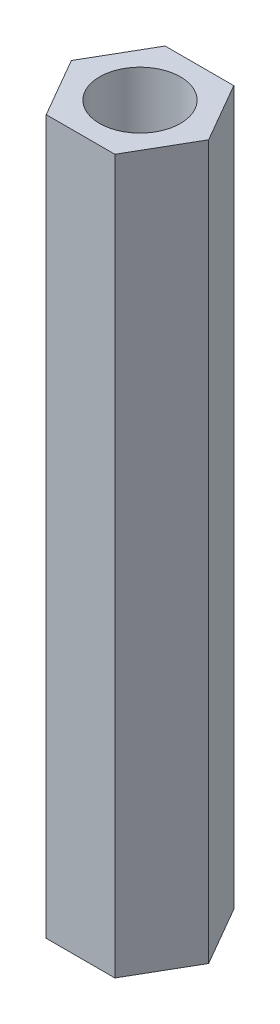
ISO-10303-21;
HEADER;
FILE_DESCRIPTION(('STEP AP214'),'2;1');
FILE_NAME('part.step','',(''),(''),'','','');
FILE_SCHEMA(('AUTOMOTIVE_DESIGN { 1 0 10303 214 1 1 1 1 }'));
ENDSEC;
DATA;
#1=APPLICATION_CONTEXT('core data for automotive mechanical design processes');
#2=APPLICATION_PROTOCOL_DEFINITION('international standard','automotive_design',2000,#1);
#3=PRODUCT_CONTEXT('',#1,'mechanical');
#4=PRODUCT('Part','Part','',(#3));
#5=PRODUCT_RELATED_PRODUCT_CATEGORY('part','',(#4));
#6=PRODUCT_DEFINITION_FORMATION('','',#4);
#7=PRODUCT_DEFINITION_CONTEXT('part definition',#1,'design');
#8=PRODUCT_DEFINITION('design','',#6,#7);
#9=PRODUCT_DEFINITION_SHAPE('','',#8);
#10=(LENGTH_UNIT() NAMED_UNIT(*) SI_UNIT(.MILLI.,.METRE.));
#11=(NAMED_UNIT(*) PLANE_ANGLE_UNIT() SI_UNIT($,.RADIAN.));
#12=(NAMED_UNIT(*) SI_UNIT($,.STERADIAN.) SOLID_ANGLE_UNIT());
#13=UNCERTAINTY_MEASURE_WITH_UNIT(LENGTH_MEASURE(1.E-05),#10,'distance_accuracy_value','');
#14=(GEOMETRIC_REPRESENTATION_CONTEXT(3) GLOBAL_UNCERTAINTY_ASSIGNED_CONTEXT((#13)) GLOBAL_UNIT_ASSIGNED_CONTEXT((#10,
#11,#12)) REPRESENTATION_CONTEXT('',''));
#15=CARTESIAN_POINT('',(0.,0.,0.));
#16=DIRECTION('',(0.,0.,1.));
#17=DIRECTION('',(1.,0.,0.));
#18=AXIS2_PLACEMENT_3D('',#15,#16,#17);
#19=CARTESIAN_POINT('',(0.,30.,0.));
#20=DIRECTION('',(0.,1.,0.));
#21=DIRECTION('',(0.,0.,1.));
#22=AXIS2_PLACEMENT_3D('',#19,#20,#21);
#23=PLANE('',#22);
#24=DIRECTION('',(0.5,0.,-0.866025403784439));
#25=VECTOR('',#24,1.);
#26=CARTESIAN_POINT('',(1.44337567297407,30.,2.5));
#27=LINE('',#26,#25);
#28=CARTESIAN_POINT('',(1.44337567297407,30.,2.5));
#29=VERTEX_POINT('',#28);
#30=CARTESIAN_POINT('',(2.88675134594813,30.,0.));
#31=VERTEX_POINT('',#30);
#32=EDGE_CURVE('E146',#29,#31,#27,.T.);
#33=ORIENTED_EDGE('',*,*,#32,.T.);
#34=DIRECTION('',(-0.5,0.,-0.866025403784438));
#35=VECTOR('',#34,1.);
#36=CARTESIAN_POINT('',(2.88675134594813,30.,0.));
#37=LINE('',#36,#35);
#38=CARTESIAN_POINT('',(1.44337567297406,30.,-2.5));
#39=VERTEX_POINT('',#38);
#40=EDGE_CURVE('E94',#31,#39,#37,.T.);
#41=ORIENTED_EDGE('',*,*,#40,.T.);
#42=DIRECTION('',(-1.,0.,0.));
#43=VECTOR('',#42,1.);
#44=CARTESIAN_POINT('',(1.44337567297406,30.,-2.5));
#45=LINE('',#44,#43);
#46=CARTESIAN_POINT('',(-1.44337567297406,30.,-2.5));
#47=VERTEX_POINT('',#46);
#48=EDGE_CURVE('E107',#39,#47,#45,.T.);
#49=ORIENTED_EDGE('',*,*,#48,.T.);
#50=DIRECTION('',(-0.5,0.,0.866025403784439));
#51=VECTOR('',#50,1.);
#52=CARTESIAN_POINT('',(-1.44337567297406,30.,-2.5));
#53=LINE('',#52,#51);
#54=CARTESIAN_POINT('',(-2.88675134594813,30.,0.));
#55=VERTEX_POINT('',#54);
#56=EDGE_CURVE('E101',#47,#55,#53,.T.);
#57=ORIENTED_EDGE('',*,*,#56,.T.);
#58=DIRECTION('',(0.5,0.,0.866025403784438));
#59=VECTOR('',#58,1.);
#60=CARTESIAN_POINT('',(-2.88675134594813,30.,0.));
#61=LINE('',#60,#59);
#62=CARTESIAN_POINT('',(-1.44337567297406,30.,2.5));
#63=VERTEX_POINT('',#62);
#64=EDGE_CURVE('E105',#55,#63,#61,.T.);
#65=ORIENTED_EDGE('',*,*,#64,.T.);
#66=DIRECTION('',(1.,0.,0.));
#67=VECTOR('',#66,1.);
#68=CARTESIAN_POINT('',(-1.44337567297406,30.,2.5));
#69=LINE('',#68,#67);
#70=EDGE_CURVE('E57',#63,#29,#69,.T.);
#71=ORIENTED_EDGE('',*,*,#70,.T.);
#72=EDGE_LOOP('',(#33,#41,#49,#57,#65,#71));
#73=FACE_BOUND('',#72,.T.);
#74=CARTESIAN_POINT('',(0.,30.,0.));
#75=DIRECTION('',(0.,1.,0.));
#76=DIRECTION('',(0.,0.,1.));
#77=AXIS2_PLACEMENT_3D('',#74,#75,#76);
#78=CIRCLE('',#77,1.7);
#79=CARTESIAN_POINT('',(0.,30.,1.7));
#80=VERTEX_POINT('',#79);
#81=EDGE_CURVE('E134',#80,#80,#78,.T.);
#82=ORIENTED_EDGE('',*,*,#81,.F.);
#83=EDGE_LOOP('',(#82));
#84=FACE_BOUND('',#83,.T.);
#85=ADVANCED_FACE('F39',(#73,#84),#23,.T.);
#86=CARTESIAN_POINT('',(0.,0.,0.));
#87=DIRECTION('',(0.,1.,0.));
#88=DIRECTION('',(0.,0.,1.));
#89=AXIS2_PLACEMENT_3D('',#86,#87,#88);
#90=PLANE('',#89);
#91=DIRECTION('',(0.5,0.,-0.866025403784439));
#92=VECTOR('',#91,1.);
#93=CARTESIAN_POINT('',(1.44337567297407,0.,2.5));
#94=LINE('',#93,#92);
#95=CARTESIAN_POINT('',(1.44337567297407,0.,2.5));
#96=VERTEX_POINT('',#95);
#97=CARTESIAN_POINT('',(2.88675134594813,0.,0.));
#98=VERTEX_POINT('',#97);
#99=EDGE_CURVE('E129',#96,#98,#94,.T.);
#100=ORIENTED_EDGE('',*,*,#99,.F.);
#101=DIRECTION('',(1.,0.,0.));
#102=VECTOR('',#101,1.);
#103=CARTESIAN_POINT('',(-1.44337567297406,0.,2.5));
#104=LINE('',#103,#102);
#105=CARTESIAN_POINT('',(-1.44337567297406,0.,2.5));
#106=VERTEX_POINT('',#105);
#107=EDGE_CURVE('E86',#106,#96,#104,.T.);
#108=ORIENTED_EDGE('',*,*,#107,.F.);
#109=DIRECTION('',(0.5,0.,0.866025403784438));
#110=VECTOR('',#109,1.);
#111=CARTESIAN_POINT('',(-2.88675134594813,0.,0.));
#112=LINE('',#111,#110);
#113=CARTESIAN_POINT('',(-2.88675134594813,0.,0.));
#114=VERTEX_POINT('',#113);
#115=EDGE_CURVE('E80',#114,#106,#112,.T.);
#116=ORIENTED_EDGE('',*,*,#115,.F.);
#117=DIRECTION('',(-0.5,0.,0.866025403784439));
#118=VECTOR('',#117,1.);
#119=CARTESIAN_POINT('',(-1.44337567297406,0.,-2.5));
#120=LINE('',#119,#118);
#121=CARTESIAN_POINT('',(-1.44337567297406,0.,-2.5));
#122=VERTEX_POINT('',#121);
#123=EDGE_CURVE('E116',#122,#114,#120,.T.);
#124=ORIENTED_EDGE('',*,*,#123,.F.);
#125=DIRECTION('',(-1.,0.,0.));
#126=VECTOR('',#125,1.);
#127=CARTESIAN_POINT('',(1.44337567297406,0.,-2.5));
#128=LINE('',#127,#126);
#129=CARTESIAN_POINT('',(1.44337567297406,0.,-2.5));
#130=VERTEX_POINT('',#129);
#131=EDGE_CURVE('E137',#130,#122,#128,.T.);
#132=ORIENTED_EDGE('',*,*,#131,.F.);
#133=DIRECTION('',(-0.5,0.,-0.866025403784438));
#134=VECTOR('',#133,1.);
#135=CARTESIAN_POINT('',(2.88675134594813,0.,0.));
#136=LINE('',#135,#134);
#137=EDGE_CURVE('E133',#98,#130,#136,.T.);
#138=ORIENTED_EDGE('',*,*,#137,.F.);
#139=EDGE_LOOP('',(#100,#108,#116,#124,#132,#138));
#140=FACE_BOUND('',#139,.T.);
#141=CARTESIAN_POINT('',(0.,0.,0.));
#142=DIRECTION('',(0.,1.,0.));
#143=DIRECTION('',(0.,0.,1.));
#144=AXIS2_PLACEMENT_3D('',#141,#142,#143);
#145=CIRCLE('',#144,1.7);
#146=CARTESIAN_POINT('',(0.,0.,1.7));
#147=VERTEX_POINT('',#146);
#148=EDGE_CURVE('E243',#147,#147,#145,.T.);
#149=ORIENTED_EDGE('',*,*,#148,.T.);
#150=EDGE_LOOP('',(#149));
#151=FACE_BOUND('',#150,.T.);
#152=ADVANCED_FACE('F159',(#140,#151),#90,.F.);
#153=CARTESIAN_POINT('',(1.44337567297407,30.,2.5));
#154=DIRECTION('',(-0.866025403784439,0.,-0.5));
#155=DIRECTION('',(-0.5,0.,0.866025403784439));
#156=AXIS2_PLACEMENT_3D('',#153,#154,#155);
#157=PLANE('',#156);
#158=ORIENTED_EDGE('',*,*,#99,.T.);
#159=DIRECTION('',(0.,-1.,0.));
#160=VECTOR('',#159,1.);
#161=CARTESIAN_POINT('',(2.88675134594813,30.,0.));
#162=LINE('',#161,#160);
#163=EDGE_CURVE('E11',#31,#98,#162,.T.);
#164=ORIENTED_EDGE('',*,*,#163,.F.);
#165=ORIENTED_EDGE('',*,*,#32,.F.);
#166=DIRECTION('',(0.,-1.,0.));
#167=VECTOR('',#166,1.);
#168=CARTESIAN_POINT('',(1.44337567297407,30.,2.5));
#169=LINE('',#168,#167);
#170=EDGE_CURVE('E125',#29,#96,#169,.T.);
#171=ORIENTED_EDGE('',*,*,#170,.T.);
#172=EDGE_LOOP('',(#158,#164,#165,#171));
#173=FACE_BOUND('',#172,.T.);
#174=ADVANCED_FACE('F41',(#173),#157,.F.);
#175=CARTESIAN_POINT('',(2.88675134594813,30.,0.));
#176=DIRECTION('',(-0.866025403784438,0.,0.5));
#177=DIRECTION('',(0.5,0.,0.866025403784439));
#178=AXIS2_PLACEMENT_3D('',#175,#176,#177);
#179=PLANE('',#178);
#180=ORIENTED_EDGE('',*,*,#137,.T.);
#181=DIRECTION('',(0.,-1.,0.));
#182=VECTOR('',#181,1.);
#183=CARTESIAN_POINT('',(1.44337567297406,30.,-2.5));
#184=LINE('',#183,#182);
#185=EDGE_CURVE('E49',#39,#130,#184,.T.);
#186=ORIENTED_EDGE('',*,*,#185,.F.);
#187=ORIENTED_EDGE('',*,*,#40,.F.);
#188=ORIENTED_EDGE('',*,*,#163,.T.);
#189=EDGE_LOOP('',(#180,#186,#187,#188));
#190=FACE_BOUND('',#189,.T.);
#191=ADVANCED_FACE('F184',(#190),#179,.F.);
#192=CARTESIAN_POINT('',(1.44337567297406,30.,-2.5));
#193=DIRECTION('',(0.,0.,1.));
#194=DIRECTION('',(1.,0.,0.));
#195=AXIS2_PLACEMENT_3D('',#192,#193,#194);
#196=PLANE('',#195);
#197=ORIENTED_EDGE('',*,*,#131,.T.);
#198=DIRECTION('',(0.,-1.,0.));
#199=VECTOR('',#198,1.);
#200=CARTESIAN_POINT('',(-1.44337567297406,30.,-2.5));
#201=LINE('',#200,#199);
#202=EDGE_CURVE('E118',#47,#122,#201,.T.);
#203=ORIENTED_EDGE('',*,*,#202,.F.);
#204=ORIENTED_EDGE('',*,*,#48,.F.);
#205=ORIENTED_EDGE('',*,*,#185,.T.);
#206=EDGE_LOOP('',(#197,#203,#204,#205));
#207=FACE_BOUND('',#206,.T.);
#208=ADVANCED_FACE('F156',(#207),#196,.F.);
#209=CARTESIAN_POINT('',(-1.44337567297406,30.,-2.5));
#210=DIRECTION('',(0.866025403784439,0.,0.5));
#211=DIRECTION('',(0.5,0.,-0.866025403784439));
#212=AXIS2_PLACEMENT_3D('',#209,#210,#211);
#213=PLANE('',#212);
#214=ORIENTED_EDGE('',*,*,#123,.T.);
#215=DIRECTION('',(0.,-1.,0.));
#216=VECTOR('',#215,1.);
#217=CARTESIAN_POINT('',(-2.88675134594813,30.,0.));
#218=LINE('',#217,#216);
#219=EDGE_CURVE('E113',#55,#114,#218,.T.);
#220=ORIENTED_EDGE('',*,*,#219,.F.);
#221=ORIENTED_EDGE('',*,*,#56,.F.);
#222=ORIENTED_EDGE('',*,*,#202,.T.);
#223=EDGE_LOOP('',(#214,#220,#221,#222));
#224=FACE_BOUND('',#223,.T.);
#225=ADVANCED_FACE('F114',(#224),#213,.F.);
#226=CARTESIAN_POINT('',(-2.88675134594813,30.,0.));
#227=DIRECTION('',(0.866025403784438,0.,-0.5));
#228=DIRECTION('',(-0.5,0.,-0.866025403784439));
#229=AXIS2_PLACEMENT_3D('',#226,#227,#228);
#230=PLANE('',#229);
#231=ORIENTED_EDGE('',*,*,#115,.T.);
#232=DIRECTION('',(0.,-1.,0.));
#233=VECTOR('',#232,1.);
#234=CARTESIAN_POINT('',(-1.44337567297406,30.,2.5));
#235=LINE('',#234,#233);
#236=EDGE_CURVE('E119',#63,#106,#235,.T.);
#237=ORIENTED_EDGE('',*,*,#236,.F.);
#238=ORIENTED_EDGE('',*,*,#64,.F.);
#239=ORIENTED_EDGE('',*,*,#219,.T.);
#240=EDGE_LOOP('',(#231,#237,#238,#239));
#241=FACE_BOUND('',#240,.T.);
#242=ADVANCED_FACE('F121',(#241),#230,.F.);
#243=CARTESIAN_POINT('',(-1.44337567297406,30.,2.5));
#244=DIRECTION('',(0.,0.,-1.));
#245=DIRECTION('',(-1.,0.,0.));
#246=AXIS2_PLACEMENT_3D('',#243,#244,#245);
#247=PLANE('',#246);
#248=ORIENTED_EDGE('',*,*,#107,.T.);
#249=ORIENTED_EDGE('',*,*,#170,.F.);
#250=ORIENTED_EDGE('',*,*,#70,.F.);
#251=ORIENTED_EDGE('',*,*,#236,.T.);
#252=EDGE_LOOP('',(#248,#249,#250,#251));
#253=FACE_BOUND('',#252,.T.);
#254=ADVANCED_FACE('F164',(#253),#247,.F.);
#255=CARTESIAN_POINT('',(0.,30.,0.));
#256=DIRECTION('',(0.,-1.,0.));
#257=DIRECTION('',(0.,0.,-1.));
#258=AXIS2_PLACEMENT_3D('',#255,#256,#257);
#259=CYLINDRICAL_SURFACE('',#258,1.7);
#260=ORIENTED_EDGE('',*,*,#81,.T.);
#261=EDGE_LOOP('',(#260));
#262=FACE_BOUND('',#261,.T.);
#263=ORIENTED_EDGE('',*,*,#148,.F.);
#264=EDGE_LOOP('',(#263));
#265=FACE_BOUND('',#264,.T.);
#266=ADVANCED_FACE('F166',(#262,#265),#259,.F.);
#267=CLOSED_SHELL('',(#85,#152,#174,#191,#208,#225,#242,#254,#266));
#268=MANIFOLD_SOLID_BREP('B2',#267);
#269=ADVANCED_BREP_SHAPE_REPRESENTATION('',(#18,#268),#14);
#270=SHAPE_DEFINITION_REPRESENTATION(#9,#269);
ENDSEC;
END-ISO-10303-21;
